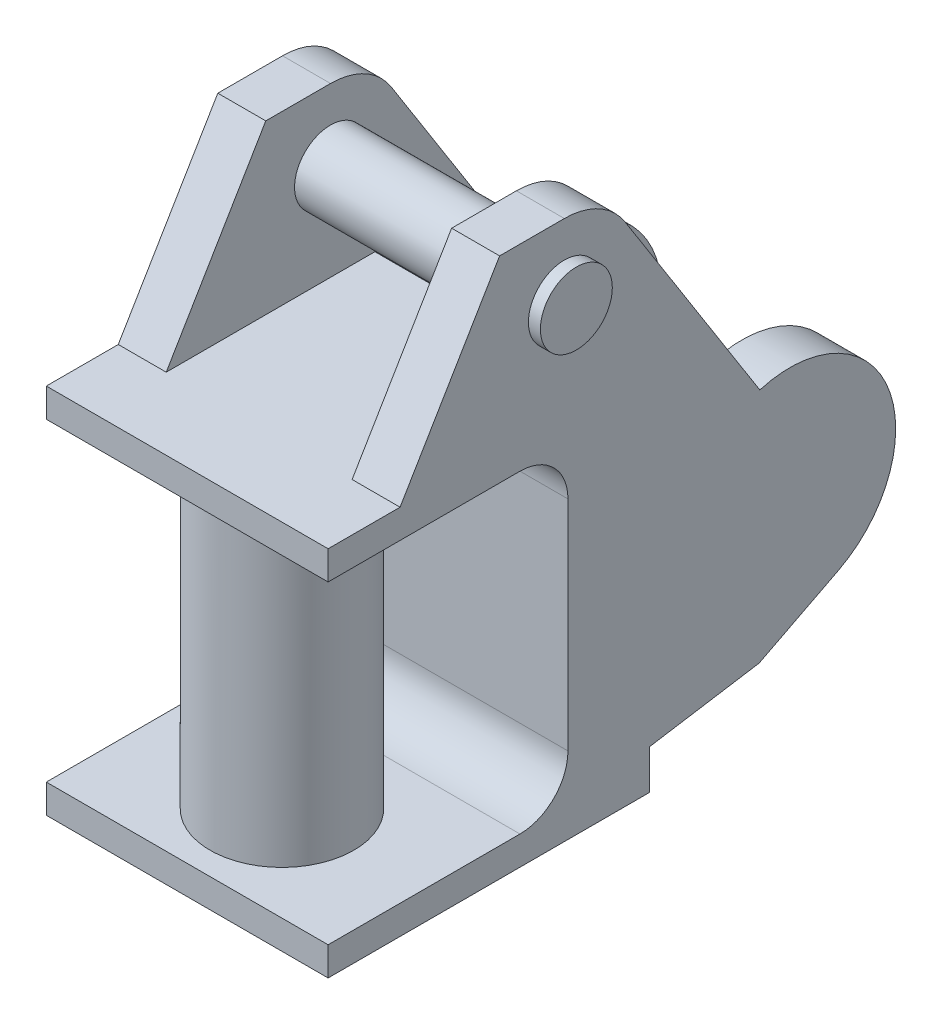
ISO-10303-21;
HEADER;
FILE_DESCRIPTION(('STEP AP214'),'2;1');
FILE_NAME('part.step','',(''),(''),'','','');
FILE_SCHEMA(('AUTOMOTIVE_DESIGN { 1 0 10303 214 1 1 1 1 }'));
ENDSEC;
DATA;
#1=APPLICATION_CONTEXT('core data for automotive mechanical design processes');
#2=APPLICATION_PROTOCOL_DEFINITION('international standard','automotive_design',2000,#1);
#3=PRODUCT_CONTEXT('',#1,'mechanical');
#4=PRODUCT('Part','Part','',(#3));
#5=PRODUCT_RELATED_PRODUCT_CATEGORY('part','',(#4));
#6=PRODUCT_DEFINITION_FORMATION('','',#4);
#7=PRODUCT_DEFINITION_CONTEXT('part definition',#1,'design');
#8=PRODUCT_DEFINITION('design','',#6,#7);
#9=PRODUCT_DEFINITION_SHAPE('','',#8);
#10=(LENGTH_UNIT() NAMED_UNIT(*) SI_UNIT(.MILLI.,.METRE.));
#11=(NAMED_UNIT(*) PLANE_ANGLE_UNIT() SI_UNIT($,.RADIAN.));
#12=(NAMED_UNIT(*) SI_UNIT($,.STERADIAN.) SOLID_ANGLE_UNIT());
#13=UNCERTAINTY_MEASURE_WITH_UNIT(LENGTH_MEASURE(1.E-05),#10,'distance_accuracy_value','');
#14=(GEOMETRIC_REPRESENTATION_CONTEXT(3) GLOBAL_UNCERTAINTY_ASSIGNED_CONTEXT((#13)) GLOBAL_UNIT_ASSIGNED_CONTEXT((#10,
#11,#12)) REPRESENTATION_CONTEXT('',''));
#15=CARTESIAN_POINT('',(0.,0.,0.));
#16=DIRECTION('',(0.,0.,1.));
#17=DIRECTION('',(1.,0.,0.));
#18=AXIS2_PLACEMENT_3D('',#15,#16,#17);
#19=CARTESIAN_POINT('',(0.,160.,-385.));
#20=DIRECTION('',(-1.,0.,0.));
#21=DIRECTION('',(0.,0.,1.));
#22=AXIS2_PLACEMENT_3D('',#19,#20,#21);
#23=CYLINDRICAL_SURFACE('',#22,20.);
#24=CARTESIAN_POINT('',(0.,160.,-385.));
#25=DIRECTION('',(1.,0.,0.));
#26=DIRECTION('',(0.,0.,-1.));
#27=AXIS2_PLACEMENT_3D('',#24,#25,#26);
#28=CIRCLE('',#27,20.);
#29=CARTESIAN_POINT('',(0.,160.,-405.));
#30=VERTEX_POINT('',#29);
#31=EDGE_CURVE('E11',#30,#30,#28,.T.);
#32=ORIENTED_EDGE('',*,*,#31,.F.);
#33=EDGE_LOOP('',(#32));
#34=FACE_BOUND('',#33,.T.);
#35=CARTESIAN_POINT('',(-155.,160.,-385.));
#36=DIRECTION('',(1.,0.,0.));
#37=DIRECTION('',(0.,0.,-1.));
#38=AXIS2_PLACEMENT_3D('',#35,#36,#37);
#39=CIRCLE('',#38,20.);
#40=CARTESIAN_POINT('',(-155.,160.,-405.));
#41=VERTEX_POINT('',#40);
#42=EDGE_CURVE('E45',#41,#41,#39,.T.);
#43=ORIENTED_EDGE('',*,*,#42,.T.);
#44=EDGE_LOOP('',(#43));
#45=FACE_BOUND('',#44,.T.);
#46=ADVANCED_FACE('F42',(#34,#45),#23,.T.);
#47=CARTESIAN_POINT('',(0.,160.,-385.));
#48=DIRECTION('',(1.,0.,0.));
#49=DIRECTION('',(0.,0.,-1.));
#50=AXIS2_PLACEMENT_3D('',#47,#48,#49);
#51=PLANE('',#50);
#52=ORIENTED_EDGE('',*,*,#31,.T.);
#53=EDGE_LOOP('',(#52));
#54=FACE_BOUND('',#53,.T.);
#55=ADVANCED_FACE('F57',(#54),#51,.T.);
#56=CARTESIAN_POINT('',(-155.,160.,-385.));
#57=DIRECTION('',(1.,0.,0.));
#58=DIRECTION('',(0.,0.,-1.));
#59=AXIS2_PLACEMENT_3D('',#56,#57,#58);
#60=PLANE('',#59);
#61=ORIENTED_EDGE('',*,*,#42,.F.);
#62=EDGE_LOOP('',(#61));
#63=FACE_BOUND('',#62,.T.);
#64=ADVANCED_FACE('F55',(#63),#60,.F.);
#65=CLOSED_SHELL('',(#46,#55,#64));
#66=MANIFOLD_SOLID_BREP('B2',#65);
#67=CARTESIAN_POINT('',(40.,160.,-385.));
#68=DIRECTION('',(1.,0.,0.));
#69=DIRECTION('',(0.,0.,-1.));
#70=AXIS2_PLACEMENT_3D('',#67,#68,#69);
#71=PLANE('',#70);
#72=DIRECTION('',(0.,-1.,0.));
#73=VECTOR('',#72,1.);
#74=CARTESIAN_POINT('',(40.,24.,0.));
#75=LINE('',#74,#73);
#76=CARTESIAN_POINT('',(40.,24.,0.));
#77=VERTEX_POINT('',#76);
#78=CARTESIAN_POINT('',(40.,0.,0.));
#79=VERTEX_POINT('',#78);
#80=EDGE_CURVE('E404',#77,#79,#75,.T.);
#81=ORIENTED_EDGE('',*,*,#80,.T.);
#82=DIRECTION('',(0.,0.,-1.));
#83=VECTOR('',#82,1.);
#84=CARTESIAN_POINT('',(40.,0.,0.));
#85=LINE('',#84,#83);
#86=CARTESIAN_POINT('',(40.,0.,-268.));
#87=VERTEX_POINT('',#86);
#88=EDGE_CURVE('E276',#79,#87,#85,.T.);
#89=ORIENTED_EDGE('',*,*,#88,.T.);
#90=DIRECTION('',(0.,1.,0.));
#91=VECTOR('',#90,1.);
#92=CARTESIAN_POINT('',(40.,0.,-268.));
#93=LINE('',#92,#91);
#94=CARTESIAN_POINT('',(40.,33.,-268.));
#95=VERTEX_POINT('',#94);
#96=EDGE_CURVE('E408',#87,#95,#93,.T.);
#97=ORIENTED_EDGE('',*,*,#96,.T.);
#98=DIRECTION('',(0.,0.15855079486993,-0.987350821869367));
#99=VECTOR('',#98,1.);
#100=CARTESIAN_POINT('',(40.,33.,-268.));
#101=LINE('',#100,#99);
#102=CARTESIAN_POINT('',(40.,47.6759727103171,-359.392375100683));
#103=VERTEX_POINT('',#102);
#104=EDGE_CURVE('E410',#95,#103,#101,.T.);
#105=ORIENTED_EDGE('',*,*,#104,.T.);
#106=DIRECTION('',(0.,0.455898949992531,-0.890031542921771));
#107=VECTOR('',#106,1.);
#108=CARTESIAN_POINT('',(40.,47.6759727103171,-359.392375100683));
#109=LINE('',#108,#107);
#110=CARTESIAN_POINT('',(40.,81.4124950097644,-425.254709276894));
#111=VERTEX_POINT('',#110);
#112=EDGE_CURVE('E412',#103,#111,#109,.T.);
#113=ORIENTED_EDGE('',*,*,#112,.T.);
#114=CARTESIAN_POINT('',(40.,160.,-385.));
#115=DIRECTION('',(1.,0.,0.));
#116=DIRECTION('',(0.,0.,-1.));
#117=AXIS2_PLACEMENT_3D('',#114,#115,#116);
#118=CIRCLE('',#117,88.2974380124222);
#119=CARTESIAN_POINT('',(40.,244.687799182257,-360.01171816184));
#120=VERTEX_POINT('',#119);
#121=EDGE_CURVE('E414',#111,#120,#118,.T.);
#122=ORIENTED_EDGE('',*,*,#121,.T.);
#123=DIRECTION('',(0.,0.844906176204705,0.534914529070902));
#124=VECTOR('',#123,1.);
#125=CARTESIAN_POINT('',(40.,244.687799182257,-360.01171816184));
#126=LINE('',#125,#124);
#127=CARTESIAN_POINT('',(40.,422.094871744254,-247.694370572282));
#128=VERTEX_POINT('',#127);
#129=EDGE_CURVE('E416',#120,#128,#126,.T.);
#130=ORIENTED_EDGE('',*,*,#129,.T.);
#131=CARTESIAN_POINT('',(40.,390.,-197.));
#132=DIRECTION('',(1.,0.,0.));
#133=DIRECTION('',(0.,0.,-1.));
#134=AXIS2_PLACEMENT_3D('',#131,#132,#133);
#135=CIRCLE('',#134,60.);
#136=CARTESIAN_POINT('',(40.,450.,-197.));
#137=VERTEX_POINT('',#136);
#138=EDGE_CURVE('E418',#128,#137,#135,.T.);
#139=ORIENTED_EDGE('',*,*,#138,.T.);
#140=DIRECTION('',(0.,0.,1.));
#141=VECTOR('',#140,1.);
#142=CARTESIAN_POINT('',(40.,450.,-197.));
#143=LINE('',#142,#141);
#144=CARTESIAN_POINT('',(40.,450.,-143.));
#145=VERTEX_POINT('',#144);
#146=EDGE_CURVE('E420',#137,#145,#143,.T.);
#147=ORIENTED_EDGE('',*,*,#146,.T.);
#148=DIRECTION('',(0.,-0.860191712453528,0.509970800954592));
#149=VECTOR('',#148,1.);
#150=CARTESIAN_POINT('',(40.,450.,-143.));
#151=LINE('',#150,#149);
#152=CARTESIAN_POINT('',(40.,310.,-60.));
#153=VERTEX_POINT('',#152);
#154=EDGE_CURVE('E422',#145,#153,#151,.T.);
#155=ORIENTED_EDGE('',*,*,#154,.T.);
#156=DIRECTION('',(0.,0.,1.));
#157=VECTOR('',#156,1.);
#158=CARTESIAN_POINT('',(40.,310.,-60.));
#159=LINE('',#158,#157);
#160=CARTESIAN_POINT('',(40.,310.,0.));
#161=VERTEX_POINT('',#160);
#162=EDGE_CURVE('E424',#153,#161,#159,.T.);
#163=ORIENTED_EDGE('',*,*,#162,.T.);
#164=DIRECTION('',(0.,-1.,0.));
#165=VECTOR('',#164,1.);
#166=CARTESIAN_POINT('',(40.,310.,0.));
#167=LINE('',#166,#165);
#168=CARTESIAN_POINT('',(40.,286.,0.));
#169=VERTEX_POINT('',#168);
#170=EDGE_CURVE('E426',#161,#169,#167,.T.);
#171=ORIENTED_EDGE('',*,*,#170,.T.);
#172=DIRECTION('',(0.,0.,-1.));
#173=VECTOR('',#172,1.);
#174=CARTESIAN_POINT('',(40.,286.,0.));
#175=LINE('',#174,#173);
#176=CARTESIAN_POINT('',(40.,286.,-160.));
#177=VERTEX_POINT('',#176);
#178=EDGE_CURVE('E428',#169,#177,#175,.T.);
#179=ORIENTED_EDGE('',*,*,#178,.T.);
#180=CARTESIAN_POINT('',(40.,246.,-160.));
#181=DIRECTION('',(1.,0.,0.));
#182=DIRECTION('',(0.,0.,-1.));
#183=AXIS2_PLACEMENT_3D('',#180,#181,#182);
#184=CIRCLE('',#183,40.);
#185=CARTESIAN_POINT('',(40.,246.,-200.));
#186=VERTEX_POINT('',#185);
#187=EDGE_CURVE('E493',#177,#186,#184,.F.);
#188=ORIENTED_EDGE('',*,*,#187,.T.);
#189=DIRECTION('',(0.,-1.,0.));
#190=VECTOR('',#189,1.);
#191=CARTESIAN_POINT('',(40.,286.,-200.));
#192=LINE('',#191,#190);
#193=CARTESIAN_POINT('',(40.,64.,-200.));
#194=VERTEX_POINT('',#193);
#195=EDGE_CURVE('E431',#186,#194,#192,.T.);
#196=ORIENTED_EDGE('',*,*,#195,.T.);
#197=CARTESIAN_POINT('',(40.,64.,-160.));
#198=DIRECTION('',(1.,0.,0.));
#199=DIRECTION('',(0.,0.,-1.));
#200=AXIS2_PLACEMENT_3D('',#197,#198,#199);
#201=CIRCLE('',#200,40.);
#202=CARTESIAN_POINT('',(40.,24.,-160.));
#203=VERTEX_POINT('',#202);
#204=EDGE_CURVE('E97',#194,#203,#201,.F.);
#205=ORIENTED_EDGE('',*,*,#204,.T.);
#206=DIRECTION('',(0.,0.,1.));
#207=VECTOR('',#206,1.);
#208=CARTESIAN_POINT('',(40.,24.,-200.));
#209=LINE('',#208,#207);
#210=EDGE_CURVE('E433',#203,#77,#209,.T.);
#211=ORIENTED_EDGE('',*,*,#210,.T.);
#212=EDGE_LOOP('',(#81,#89,#97,#105,#113,#122,#130,#139,#147,#155,#163,#171,#179,#188,#196,#205,#211));
#213=FACE_BOUND('',#212,.T.);
#214=CARTESIAN_POINT('',(40.,390.,-197.));
#215=DIRECTION('',(1.,0.,0.));
#216=DIRECTION('',(0.,0.,-1.));
#217=AXIS2_PLACEMENT_3D('',#214,#215,#216);
#218=CIRCLE('',#217,30.);
#219=CARTESIAN_POINT('',(40.,390.,-227.));
#220=VERTEX_POINT('',#219);
#221=EDGE_CURVE('E400',#220,#220,#218,.T.);
#222=ORIENTED_EDGE('',*,*,#221,.F.);
#223=EDGE_LOOP('',(#222));
#224=FACE_BOUND('',#223,.T.);
#225=ADVANCED_FACE('F82',(#213,#224),#71,.T.);
#226=CARTESIAN_POINT('',(0.,160.,-385.));
#227=DIRECTION('',(1.,0.,0.));
#228=DIRECTION('',(0.,0.,-1.));
#229=AXIS2_PLACEMENT_3D('',#226,#227,#228);
#230=PLANE('',#229);
#231=DIRECTION('',(0.,0.,-1.));
#232=VECTOR('',#231,1.);
#233=CARTESIAN_POINT('',(0.,0.,0.));
#234=LINE('',#233,#232);
#235=CARTESIAN_POINT('',(0.,0.,-234.));
#236=VERTEX_POINT('',#235);
#237=CARTESIAN_POINT('',(0.,0.,-268.));
#238=VERTEX_POINT('',#237);
#239=EDGE_CURVE('E403',#236,#238,#234,.T.);
#240=ORIENTED_EDGE('',*,*,#239,.F.);
#241=DIRECTION('',(0.,1.,0.));
#242=VECTOR('',#241,1.);
#243=CARTESIAN_POINT('',(0.,0.,-234.));
#244=LINE('',#243,#242);
#245=CARTESIAN_POINT('',(0.,310.,-234.));
#246=VERTEX_POINT('',#245);
#247=EDGE_CURVE('E384',#236,#246,#244,.T.);
#248=ORIENTED_EDGE('',*,*,#247,.T.);
#249=DIRECTION('',(0.,0.,1.));
#250=VECTOR('',#249,1.);
#251=CARTESIAN_POINT('',(0.,310.,-234.));
#252=LINE('',#251,#250);
#253=CARTESIAN_POINT('',(0.,310.,-60.));
#254=VERTEX_POINT('',#253);
#255=EDGE_CURVE('E387',#246,#254,#252,.T.);
#256=ORIENTED_EDGE('',*,*,#255,.T.);
#257=DIRECTION('',(0.,-0.860191712453528,0.509970800954592));
#258=VECTOR('',#257,1.);
#259=CARTESIAN_POINT('',(0.,450.,-143.));
#260=LINE('',#259,#258);
#261=CARTESIAN_POINT('',(0.,450.,-143.));
#262=VERTEX_POINT('',#261);
#263=EDGE_CURVE('E406',#262,#254,#260,.T.);
#264=ORIENTED_EDGE('',*,*,#263,.F.);
#265=DIRECTION('',(0.,0.,1.));
#266=VECTOR('',#265,1.);
#267=CARTESIAN_POINT('',(0.,450.,-197.));
#268=LINE('',#267,#266);
#269=CARTESIAN_POINT('',(0.,450.,-197.));
#270=VERTEX_POINT('',#269);
#271=EDGE_CURVE('E448',#270,#262,#268,.T.);
#272=ORIENTED_EDGE('',*,*,#271,.F.);
#273=CARTESIAN_POINT('',(0.,390.,-197.));
#274=DIRECTION('',(1.,0.,0.));
#275=DIRECTION('',(0.,0.,-1.));
#276=AXIS2_PLACEMENT_3D('',#273,#274,#275);
#277=CIRCLE('',#276,60.);
#278=CARTESIAN_POINT('',(0.,422.094871744254,-247.694370572282));
#279=VERTEX_POINT('',#278);
#280=EDGE_CURVE('E446',#279,#270,#277,.T.);
#281=ORIENTED_EDGE('',*,*,#280,.F.);
#282=DIRECTION('',(0.,0.844906176204705,0.534914529070902));
#283=VECTOR('',#282,1.);
#284=CARTESIAN_POINT('',(0.,244.687799182257,-360.01171816184));
#285=LINE('',#284,#283);
#286=CARTESIAN_POINT('',(0.,244.687799182257,-360.01171816184));
#287=VERTEX_POINT('',#286);
#288=EDGE_CURVE('E444',#287,#279,#285,.T.);
#289=ORIENTED_EDGE('',*,*,#288,.F.);
#290=CARTESIAN_POINT('',(0.,160.,-385.));
#291=DIRECTION('',(1.,0.,0.));
#292=DIRECTION('',(0.,0.,-1.));
#293=AXIS2_PLACEMENT_3D('',#290,#291,#292);
#294=CIRCLE('',#293,88.2974380124222);
#295=CARTESIAN_POINT('',(0.,81.4124950097644,-425.254709276894));
#296=VERTEX_POINT('',#295);
#297=EDGE_CURVE('E442',#296,#287,#294,.T.);
#298=ORIENTED_EDGE('',*,*,#297,.F.);
#299=DIRECTION('',(0.,0.455898949992531,-0.890031542921771));
#300=VECTOR('',#299,1.);
#301=CARTESIAN_POINT('',(0.,47.6759727103171,-359.392375100683));
#302=LINE('',#301,#300);
#303=CARTESIAN_POINT('',(0.,47.6759727103171,-359.392375100683));
#304=VERTEX_POINT('',#303);
#305=EDGE_CURVE('E440',#304,#296,#302,.T.);
#306=ORIENTED_EDGE('',*,*,#305,.F.);
#307=DIRECTION('',(0.,0.15855079486993,-0.987350821869367));
#308=VECTOR('',#307,1.);
#309=CARTESIAN_POINT('',(0.,33.,-268.));
#310=LINE('',#309,#308);
#311=CARTESIAN_POINT('',(0.,33.,-268.));
#312=VERTEX_POINT('',#311);
#313=EDGE_CURVE('E438',#312,#304,#310,.T.);
#314=ORIENTED_EDGE('',*,*,#313,.F.);
#315=DIRECTION('',(0.,1.,0.));
#316=VECTOR('',#315,1.);
#317=CARTESIAN_POINT('',(0.,0.,-268.));
#318=LINE('',#317,#316);
#319=EDGE_CURVE('E436',#238,#312,#318,.T.);
#320=ORIENTED_EDGE('',*,*,#319,.F.);
#321=EDGE_LOOP('',(#240,#248,#256,#264,#272,#281,#289,#298,#306,#314,#320));
#322=FACE_BOUND('',#321,.T.);
#323=CARTESIAN_POINT('',(0.,390.,-197.));
#324=DIRECTION('',(1.,0.,0.));
#325=DIRECTION('',(0.,0.,-1.));
#326=AXIS2_PLACEMENT_3D('',#323,#324,#325);
#327=CIRCLE('',#326,30.);
#328=CARTESIAN_POINT('',(0.,390.,-227.));
#329=VERTEX_POINT('',#328);
#330=EDGE_CURVE('E955',#329,#329,#327,.F.);
#331=ORIENTED_EDGE('',*,*,#330,.F.);
#332=EDGE_LOOP('',(#331));
#333=FACE_BOUND('',#332,.T.);
#334=ADVANCED_FACE('F568',(#322,#333),#230,.F.);
#335=CARTESIAN_POINT('',(40.,24.,0.));
#336=DIRECTION('',(0.,0.,-1.));
#337=DIRECTION('',(0.,1.,0.));
#338=AXIS2_PLACEMENT_3D('',#335,#336,#337);
#339=PLANE('',#338);
#340=DIRECTION('',(-1.,0.,0.));
#341=VECTOR('',#340,1.);
#342=CARTESIAN_POINT('',(40.,24.,0.));
#343=LINE('',#342,#341);
#344=CARTESIAN_POINT('',(-195.,24.,0.));
#345=VERTEX_POINT('',#344);
#346=EDGE_CURVE('E297',#77,#345,#343,.T.);
#347=ORIENTED_EDGE('',*,*,#346,.T.);
#348=DIRECTION('',(0.,-1.,0.));
#349=VECTOR('',#348,1.);
#350=CARTESIAN_POINT('',(-195.,24.,0.));
#351=LINE('',#350,#349);
#352=CARTESIAN_POINT('',(-195.,0.,0.));
#353=VERTEX_POINT('',#352);
#354=EDGE_CURVE('E289',#345,#353,#351,.T.);
#355=ORIENTED_EDGE('',*,*,#354,.T.);
#356=DIRECTION('',(-1.,0.,0.));
#357=VECTOR('',#356,1.);
#358=CARTESIAN_POINT('',(40.,0.,0.));
#359=LINE('',#358,#357);
#360=EDGE_CURVE('E269',#79,#353,#359,.T.);
#361=ORIENTED_EDGE('',*,*,#360,.F.);
#362=ORIENTED_EDGE('',*,*,#80,.F.);
#363=EDGE_LOOP('',(#347,#355,#361,#362));
#364=FACE_BOUND('',#363,.T.);
#365=ADVANCED_FACE('F295',(#364),#339,.F.);
#366=CARTESIAN_POINT('',(40.,0.,0.));
#367=DIRECTION('',(0.,1.,0.));
#368=DIRECTION('',(0.,0.,1.));
#369=AXIS2_PLACEMENT_3D('',#366,#367,#368);
#370=PLANE('',#369);
#371=ORIENTED_EDGE('',*,*,#360,.T.);
#372=DIRECTION('',(0.,0.,-1.));
#373=VECTOR('',#372,1.);
#374=CARTESIAN_POINT('',(-195.,0.,0.));
#375=LINE('',#374,#373);
#376=CARTESIAN_POINT('',(-195.,0.,-268.));
#377=VERTEX_POINT('',#376);
#378=EDGE_CURVE('E273',#353,#377,#375,.T.);
#379=ORIENTED_EDGE('',*,*,#378,.T.);
#380=DIRECTION('',(1.,0.,0.));
#381=VECTOR('',#380,1.);
#382=CARTESIAN_POINT('',(-195.,0.,-268.));
#383=LINE('',#382,#381);
#384=CARTESIAN_POINT('',(-155.,0.,-268.));
#385=VERTEX_POINT('',#384);
#386=EDGE_CURVE('E381',#377,#385,#383,.T.);
#387=ORIENTED_EDGE('',*,*,#386,.T.);
#388=DIRECTION('',(0.,0.,-1.));
#389=VECTOR('',#388,1.);
#390=CARTESIAN_POINT('',(-155.,0.,0.));
#391=LINE('',#390,#389);
#392=CARTESIAN_POINT('',(-155.,0.,-234.));
#393=VERTEX_POINT('',#392);
#394=EDGE_CURVE('E344',#393,#385,#391,.T.);
#395=ORIENTED_EDGE('',*,*,#394,.F.);
#396=DIRECTION('',(-1.,0.,0.));
#397=VECTOR('',#396,1.);
#398=CARTESIAN_POINT('',(0.,0.,-234.));
#399=LINE('',#398,#397);
#400=EDGE_CURVE('E397',#236,#393,#399,.T.);
#401=ORIENTED_EDGE('',*,*,#400,.F.);
#402=ORIENTED_EDGE('',*,*,#239,.T.);
#403=DIRECTION('',(-1.,0.,0.));
#404=VECTOR('',#403,1.);
#405=CARTESIAN_POINT('',(40.,0.,-268.));
#406=LINE('',#405,#404);
#407=EDGE_CURVE('E282',#87,#238,#406,.T.);
#408=ORIENTED_EDGE('',*,*,#407,.F.);
#409=ORIENTED_EDGE('',*,*,#88,.F.);
#410=EDGE_LOOP('',(#371,#379,#387,#395,#401,#402,#408,#409));
#411=FACE_BOUND('',#410,.T.);
#412=ADVANCED_FACE('F271',(#411),#370,.F.);
#413=CARTESIAN_POINT('',(40.,0.,-268.));
#414=DIRECTION('',(0.,0.,1.));
#415=DIRECTION('',(1.,0.,0.));
#416=AXIS2_PLACEMENT_3D('',#413,#414,#415);
#417=PLANE('',#416);
#418=ORIENTED_EDGE('',*,*,#319,.T.);
#419=DIRECTION('',(-1.,0.,0.));
#420=VECTOR('',#419,1.);
#421=CARTESIAN_POINT('',(40.,33.,-268.));
#422=LINE('',#421,#420);
#423=EDGE_CURVE('E478',#95,#312,#422,.T.);
#424=ORIENTED_EDGE('',*,*,#423,.F.);
#425=ORIENTED_EDGE('',*,*,#96,.F.);
#426=ORIENTED_EDGE('',*,*,#407,.T.);
#427=EDGE_LOOP('',(#418,#424,#425,#426));
#428=FACE_BOUND('',#427,.T.);
#429=ADVANCED_FACE('F573',(#428),#417,.F.);
#430=CARTESIAN_POINT('',(40.,33.,-268.));
#431=DIRECTION('',(0.,0.987350821869367,0.15855079486993));
#432=DIRECTION('',(0.,-0.15855079486993,0.987350821869367));
#433=AXIS2_PLACEMENT_3D('',#430,#431,#432);
#434=PLANE('',#433);
#435=ORIENTED_EDGE('',*,*,#313,.T.);
#436=DIRECTION('',(-1.,0.,0.));
#437=VECTOR('',#436,1.);
#438=CARTESIAN_POINT('',(40.,47.6759727103171,-359.392375100683));
#439=LINE('',#438,#437);
#440=EDGE_CURVE('E475',#103,#304,#439,.T.);
#441=ORIENTED_EDGE('',*,*,#440,.F.);
#442=ORIENTED_EDGE('',*,*,#104,.F.);
#443=ORIENTED_EDGE('',*,*,#423,.T.);
#444=EDGE_LOOP('',(#435,#441,#442,#443));
#445=FACE_BOUND('',#444,.T.);
#446=ADVANCED_FACE('F580',(#445),#434,.F.);
#447=CARTESIAN_POINT('',(40.,47.6759727103171,-359.392375100683));
#448=DIRECTION('',(0.,0.890031542921771,0.455898949992531));
#449=DIRECTION('',(0.,-0.455898949992531,0.890031542921771));
#450=AXIS2_PLACEMENT_3D('',#447,#448,#449);
#451=PLANE('',#450);
#452=ORIENTED_EDGE('',*,*,#305,.T.);
#453=DIRECTION('',(-1.,0.,0.));
#454=VECTOR('',#453,1.);
#455=CARTESIAN_POINT('',(40.,81.4124950097644,-425.254709276894));
#456=LINE('',#455,#454);
#457=EDGE_CURVE('E472',#111,#296,#456,.T.);
#458=ORIENTED_EDGE('',*,*,#457,.F.);
#459=ORIENTED_EDGE('',*,*,#112,.F.);
#460=ORIENTED_EDGE('',*,*,#440,.T.);
#461=EDGE_LOOP('',(#452,#458,#459,#460));
#462=FACE_BOUND('',#461,.T.);
#463=ADVANCED_FACE('F583',(#462),#451,.F.);
#464=CARTESIAN_POINT('',(40.,160.,-385.));
#465=DIRECTION('',(-1.,0.,0.));
#466=DIRECTION('',(0.,0.,1.));
#467=AXIS2_PLACEMENT_3D('',#464,#465,#466);
#468=CYLINDRICAL_SURFACE('',#467,88.2974380124222);
#469=ORIENTED_EDGE('',*,*,#297,.T.);
#470=DIRECTION('',(-1.,0.,0.));
#471=VECTOR('',#470,1.);
#472=CARTESIAN_POINT('',(40.,244.687799182257,-360.01171816184));
#473=LINE('',#472,#471);
#474=EDGE_CURVE('E469',#120,#287,#473,.T.);
#475=ORIENTED_EDGE('',*,*,#474,.F.);
#476=ORIENTED_EDGE('',*,*,#121,.F.);
#477=ORIENTED_EDGE('',*,*,#457,.T.);
#478=EDGE_LOOP('',(#469,#475,#476,#477));
#479=FACE_BOUND('',#478,.T.);
#480=ADVANCED_FACE('F588',(#479),#468,.T.);
#481=CARTESIAN_POINT('',(40.,244.687799182257,-360.01171816184));
#482=DIRECTION('',(0.,-0.534914529070902,0.844906176204705));
#483=DIRECTION('',(0.,-0.844906176204705,-0.534914529070902));
#484=AXIS2_PLACEMENT_3D('',#481,#482,#483);
#485=PLANE('',#484);
#486=ORIENTED_EDGE('',*,*,#288,.T.);
#487=DIRECTION('',(-1.,0.,0.));
#488=VECTOR('',#487,1.);
#489=CARTESIAN_POINT('',(40.,422.094871744254,-247.694370572282));
#490=LINE('',#489,#488);
#491=EDGE_CURVE('E466',#128,#279,#490,.T.);
#492=ORIENTED_EDGE('',*,*,#491,.F.);
#493=ORIENTED_EDGE('',*,*,#129,.F.);
#494=ORIENTED_EDGE('',*,*,#474,.T.);
#495=EDGE_LOOP('',(#486,#492,#493,#494));
#496=FACE_BOUND('',#495,.T.);
#497=ADVANCED_FACE('F594',(#496),#485,.F.);
#498=CARTESIAN_POINT('',(40.,390.,-197.));
#499=DIRECTION('',(-1.,0.,0.));
#500=DIRECTION('',(0.,0.,1.));
#501=AXIS2_PLACEMENT_3D('',#498,#499,#500);
#502=CYLINDRICAL_SURFACE('',#501,60.);
#503=ORIENTED_EDGE('',*,*,#280,.T.);
#504=DIRECTION('',(-1.,0.,0.));
#505=VECTOR('',#504,1.);
#506=CARTESIAN_POINT('',(40.,450.,-197.));
#507=LINE('',#506,#505);
#508=EDGE_CURVE('E463',#137,#270,#507,.T.);
#509=ORIENTED_EDGE('',*,*,#508,.F.);
#510=ORIENTED_EDGE('',*,*,#138,.F.);
#511=ORIENTED_EDGE('',*,*,#491,.T.);
#512=EDGE_LOOP('',(#503,#509,#510,#511));
#513=FACE_BOUND('',#512,.T.);
#514=ADVANCED_FACE('F598',(#513),#502,.T.);
#515=CARTESIAN_POINT('',(40.,450.,-197.));
#516=DIRECTION('',(0.,-1.,0.));
#517=DIRECTION('',(0.,0.,-1.));
#518=AXIS2_PLACEMENT_3D('',#515,#516,#517);
#519=PLANE('',#518);
#520=ORIENTED_EDGE('',*,*,#271,.T.);
#521=DIRECTION('',(-1.,0.,0.));
#522=VECTOR('',#521,1.);
#523=CARTESIAN_POINT('',(40.,450.,-143.));
#524=LINE('',#523,#522);
#525=EDGE_CURVE('E460',#145,#262,#524,.T.);
#526=ORIENTED_EDGE('',*,*,#525,.F.);
#527=ORIENTED_EDGE('',*,*,#146,.F.);
#528=ORIENTED_EDGE('',*,*,#508,.T.);
#529=EDGE_LOOP('',(#520,#526,#527,#528));
#530=FACE_BOUND('',#529,.T.);
#531=ADVANCED_FACE('F603',(#530),#519,.F.);
#532=CARTESIAN_POINT('',(40.,450.,-143.));
#533=DIRECTION('',(0.,-0.509970800954592,-0.860191712453528));
#534=DIRECTION('',(0.,0.860191712453528,-0.509970800954592));
#535=AXIS2_PLACEMENT_3D('',#532,#533,#534);
#536=PLANE('',#535);
#537=ORIENTED_EDGE('',*,*,#263,.T.);
#538=DIRECTION('',(-1.,0.,0.));
#539=VECTOR('',#538,1.);
#540=CARTESIAN_POINT('',(40.,310.,-60.));
#541=LINE('',#540,#539);
#542=EDGE_CURVE('E457',#153,#254,#541,.T.);
#543=ORIENTED_EDGE('',*,*,#542,.F.);
#544=ORIENTED_EDGE('',*,*,#154,.F.);
#545=ORIENTED_EDGE('',*,*,#525,.T.);
#546=EDGE_LOOP('',(#537,#543,#544,#545));
#547=FACE_BOUND('',#546,.T.);
#548=ADVANCED_FACE('F607',(#547),#536,.F.);
#549=CARTESIAN_POINT('',(40.,310.,-60.));
#550=DIRECTION('',(0.,-1.,0.));
#551=DIRECTION('',(0.,0.,-1.));
#552=AXIS2_PLACEMENT_3D('',#549,#550,#551);
#553=PLANE('',#552);
#554=ORIENTED_EDGE('',*,*,#542,.T.);
#555=ORIENTED_EDGE('',*,*,#255,.F.);
#556=DIRECTION('',(-1.,0.,0.));
#557=VECTOR('',#556,1.);
#558=CARTESIAN_POINT('',(0.,310.,-234.));
#559=LINE('',#558,#557);
#560=CARTESIAN_POINT('',(-155.,310.,-234.));
#561=VERTEX_POINT('',#560);
#562=EDGE_CURVE('E390',#246,#561,#559,.T.);
#563=ORIENTED_EDGE('',*,*,#562,.T.);
#564=DIRECTION('',(0.,0.,1.));
#565=VECTOR('',#564,1.);
#566=CARTESIAN_POINT('',(-155.,310.,-234.));
#567=LINE('',#566,#565);
#568=CARTESIAN_POINT('',(-155.,310.,-60.));
#569=VERTEX_POINT('',#568);
#570=EDGE_CURVE('E388',#561,#569,#567,.T.);
#571=ORIENTED_EDGE('',*,*,#570,.T.);
#572=DIRECTION('',(1.,0.,0.));
#573=VECTOR('',#572,1.);
#574=CARTESIAN_POINT('',(-195.,310.,-60.));
#575=LINE('',#574,#573);
#576=CARTESIAN_POINT('',(-195.,310.,-60.));
#577=VERTEX_POINT('',#576);
#578=EDGE_CURVE('E343',#577,#569,#575,.T.);
#579=ORIENTED_EDGE('',*,*,#578,.F.);
#580=DIRECTION('',(0.,0.,1.));
#581=VECTOR('',#580,1.);
#582=CARTESIAN_POINT('',(-195.,310.,-60.));
#583=LINE('',#582,#581);
#584=CARTESIAN_POINT('',(-195.,310.,0.));
#585=VERTEX_POINT('',#584);
#586=EDGE_CURVE('E329',#577,#585,#583,.T.);
#587=ORIENTED_EDGE('',*,*,#586,.T.);
#588=DIRECTION('',(-1.,0.,0.));
#589=VECTOR('',#588,1.);
#590=CARTESIAN_POINT('',(40.,310.,0.));
#591=LINE('',#590,#589);
#592=EDGE_CURVE('E455',#161,#585,#591,.T.);
#593=ORIENTED_EDGE('',*,*,#592,.F.);
#594=ORIENTED_EDGE('',*,*,#162,.F.);
#595=EDGE_LOOP('',(#554,#555,#563,#571,#579,#587,#593,#594));
#596=FACE_BOUND('',#595,.T.);
#597=ADVANCED_FACE('F530',(#596),#553,.F.);
#598=CARTESIAN_POINT('',(40.,310.,0.));
#599=DIRECTION('',(0.,0.,-1.));
#600=DIRECTION('',(0.,1.,0.));
#601=AXIS2_PLACEMENT_3D('',#598,#599,#600);
#602=PLANE('',#601);
#603=ORIENTED_EDGE('',*,*,#592,.T.);
#604=DIRECTION('',(0.,-1.,0.));
#605=VECTOR('',#604,1.);
#606=CARTESIAN_POINT('',(-195.,310.,0.));
#607=LINE('',#606,#605);
#608=CARTESIAN_POINT('',(-195.,286.,0.));
#609=VERTEX_POINT('',#608);
#610=EDGE_CURVE('E332',#585,#609,#607,.T.);
#611=ORIENTED_EDGE('',*,*,#610,.T.);
#612=DIRECTION('',(-1.,0.,0.));
#613=VECTOR('',#612,1.);
#614=CARTESIAN_POINT('',(40.,286.,0.));
#615=LINE('',#614,#613);
#616=EDGE_CURVE('E453',#169,#609,#615,.T.);
#617=ORIENTED_EDGE('',*,*,#616,.F.);
#618=ORIENTED_EDGE('',*,*,#170,.F.);
#619=EDGE_LOOP('',(#603,#611,#617,#618));
#620=FACE_BOUND('',#619,.T.);
#621=ADVANCED_FACE('F524',(#620),#602,.F.);
#622=CARTESIAN_POINT('',(40.,286.,0.));
#623=DIRECTION('',(0.,1.,0.));
#624=DIRECTION('',(0.,0.,1.));
#625=AXIS2_PLACEMENT_3D('',#622,#623,#624);
#626=PLANE('',#625);
#627=CARTESIAN_POINT('',(-77.5,286.,-79.));
#628=DIRECTION('',(0.,1.,0.));
#629=DIRECTION('',(0.,0.,1.));
#630=AXIS2_PLACEMENT_3D('',#627,#628,#629);
#631=CIRCLE('',#630,60.);
#632=CARTESIAN_POINT('',(-77.5,286.,-19.));
#633=VERTEX_POINT('',#632);
#634=EDGE_CURVE('E40',#633,#633,#631,.F.);
#635=ORIENTED_EDGE('',*,*,#634,.F.);
#636=EDGE_LOOP('',(#635));
#637=FACE_BOUND('',#636,.T.);
#638=DIRECTION('',(0.,0.,-1.));
#639=VECTOR('',#638,1.);
#640=CARTESIAN_POINT('',(-195.,286.,0.));
#641=LINE('',#640,#639);
#642=CARTESIAN_POINT('',(-195.,286.,-160.));
#643=VERTEX_POINT('',#642);
#644=EDGE_CURVE('E335',#609,#643,#641,.T.);
#645=ORIENTED_EDGE('',*,*,#644,.T.);
#646=DIRECTION('',(-1.,0.,0.));
#647=VECTOR('',#646,1.);
#648=CARTESIAN_POINT('',(40.,286.,-160.));
#649=LINE('',#648,#647);
#650=EDGE_CURVE('E487',#643,#177,#649,.F.);
#651=ORIENTED_EDGE('',*,*,#650,.T.);
#652=ORIENTED_EDGE('',*,*,#178,.F.);
#653=ORIENTED_EDGE('',*,*,#616,.T.);
#654=EDGE_LOOP('',(#645,#651,#652,#653));
#655=FACE_BOUND('',#654,.T.);
#656=ADVANCED_FACE('F520',(#637,#655),#626,.F.);
#657=CARTESIAN_POINT('',(40.,286.,-200.));
#658=DIRECTION('',(0.,0.,-1.));
#659=DIRECTION('',(0.,1.,0.));
#660=AXIS2_PLACEMENT_3D('',#657,#658,#659);
#661=PLANE('',#660);
#662=ORIENTED_EDGE('',*,*,#195,.F.);
#663=DIRECTION('',(-1.,0.,0.));
#664=VECTOR('',#663,1.);
#665=CARTESIAN_POINT('',(-195.,246.,-200.));
#666=LINE('',#665,#664);
#667=CARTESIAN_POINT('',(-195.,246.,-200.));
#668=VERTEX_POINT('',#667);
#669=EDGE_CURVE('E484',#186,#668,#666,.T.);
#670=ORIENTED_EDGE('',*,*,#669,.T.);
#671=DIRECTION('',(0.,-1.,0.));
#672=VECTOR('',#671,1.);
#673=CARTESIAN_POINT('',(-195.,286.,-200.));
#674=LINE('',#673,#672);
#675=CARTESIAN_POINT('',(-195.,64.,-200.));
#676=VERTEX_POINT('',#675);
#677=EDGE_CURVE('E338',#668,#676,#674,.T.);
#678=ORIENTED_EDGE('',*,*,#677,.T.);
#679=DIRECTION('',(-1.,0.,0.));
#680=VECTOR('',#679,1.);
#681=CARTESIAN_POINT('',(40.,64.,-200.));
#682=LINE('',#681,#680);
#683=EDGE_CURVE('E281',#676,#194,#682,.F.);
#684=ORIENTED_EDGE('',*,*,#683,.T.);
#685=EDGE_LOOP('',(#662,#670,#678,#684));
#686=FACE_BOUND('',#685,.T.);
#687=ADVANCED_FACE('F505',(#686),#661,.F.);
#688=CARTESIAN_POINT('',(40.,24.,-200.));
#689=DIRECTION('',(0.,-1.,0.));
#690=DIRECTION('',(0.,0.,-1.));
#691=AXIS2_PLACEMENT_3D('',#688,#689,#690);
#692=PLANE('',#691);
#693=CARTESIAN_POINT('',(-77.5,24.,-79.));
#694=DIRECTION('',(0.,-1.,0.));
#695=DIRECTION('',(0.,0.,-1.));
#696=AXIS2_PLACEMENT_3D('',#693,#694,#695);
#697=CIRCLE('',#696,60.);
#698=CARTESIAN_POINT('',(-77.5,24.,-139.));
#699=VERTEX_POINT('',#698);
#700=EDGE_CURVE('E90',#699,#699,#697,.F.);
#701=ORIENTED_EDGE('',*,*,#700,.F.);
#702=EDGE_LOOP('',(#701));
#703=FACE_BOUND('',#702,.T.);
#704=ORIENTED_EDGE('',*,*,#210,.F.);
#705=DIRECTION('',(-1.,0.,0.));
#706=VECTOR('',#705,1.);
#707=CARTESIAN_POINT('',(-195.,24.,-160.));
#708=LINE('',#707,#706);
#709=CARTESIAN_POINT('',(-195.,24.,-160.));
#710=VERTEX_POINT('',#709);
#711=EDGE_CURVE('E489',#203,#710,#708,.T.);
#712=ORIENTED_EDGE('',*,*,#711,.T.);
#713=DIRECTION('',(0.,0.,1.));
#714=VECTOR('',#713,1.);
#715=CARTESIAN_POINT('',(-195.,24.,-200.));
#716=LINE('',#715,#714);
#717=EDGE_CURVE('E341',#710,#345,#716,.T.);
#718=ORIENTED_EDGE('',*,*,#717,.T.);
#719=ORIENTED_EDGE('',*,*,#346,.F.);
#720=EDGE_LOOP('',(#704,#712,#718,#719));
#721=FACE_BOUND('',#720,.T.);
#722=ADVANCED_FACE('F501',(#703,#721),#692,.F.);
#723=CARTESIAN_POINT('',(0.,0.,-234.));
#724=DIRECTION('',(0.,0.,1.));
#725=DIRECTION('',(1.,0.,0.));
#726=AXIS2_PLACEMENT_3D('',#723,#724,#725);
#727=PLANE('',#726);
#728=DIRECTION('',(0.,1.,0.));
#729=VECTOR('',#728,1.);
#730=CARTESIAN_POINT('',(-155.,0.,-234.));
#731=LINE('',#730,#729);
#732=EDGE_CURVE('E383',#393,#561,#731,.T.);
#733=ORIENTED_EDGE('',*,*,#732,.T.);
#734=ORIENTED_EDGE('',*,*,#562,.F.);
#735=ORIENTED_EDGE('',*,*,#247,.F.);
#736=ORIENTED_EDGE('',*,*,#400,.T.);
#737=EDGE_LOOP('',(#733,#734,#735,#736));
#738=FACE_BOUND('',#737,.T.);
#739=ADVANCED_FACE('F504',(#738),#727,.F.);
#740=CARTESIAN_POINT('',(-195.,160.,-385.));
#741=DIRECTION('',(-1.,0.,0.));
#742=DIRECTION('',(0.,0.,-1.));
#743=AXIS2_PLACEMENT_3D('',#740,#741,#742);
#744=PLANE('',#743);
#745=ORIENTED_EDGE('',*,*,#354,.F.);
#746=ORIENTED_EDGE('',*,*,#717,.F.);
#747=CARTESIAN_POINT('',(-195.,64.,-160.));
#748=DIRECTION('',(-1.,0.,0.));
#749=DIRECTION('',(0.,0.,1.));
#750=AXIS2_PLACEMENT_3D('',#747,#748,#749);
#751=CIRCLE('',#750,40.);
#752=EDGE_CURVE('E105',#710,#676,#751,.F.);
#753=ORIENTED_EDGE('',*,*,#752,.T.);
#754=ORIENTED_EDGE('',*,*,#677,.F.);
#755=CARTESIAN_POINT('',(-195.,246.,-160.));
#756=DIRECTION('',(-1.,0.,0.));
#757=DIRECTION('',(0.,0.,1.));
#758=AXIS2_PLACEMENT_3D('',#755,#756,#757);
#759=CIRCLE('',#758,40.);
#760=EDGE_CURVE('E491',#668,#643,#759,.F.);
#761=ORIENTED_EDGE('',*,*,#760,.T.);
#762=ORIENTED_EDGE('',*,*,#644,.F.);
#763=ORIENTED_EDGE('',*,*,#610,.F.);
#764=ORIENTED_EDGE('',*,*,#586,.F.);
#765=DIRECTION('',(0.,-0.860191712453528,0.509970800954592));
#766=VECTOR('',#765,1.);
#767=CARTESIAN_POINT('',(-195.,450.,-143.));
#768=LINE('',#767,#766);
#769=CARTESIAN_POINT('',(-195.,450.,-143.));
#770=VERTEX_POINT('',#769);
#771=EDGE_CURVE('E326',#770,#577,#768,.T.);
#772=ORIENTED_EDGE('',*,*,#771,.F.);
#773=DIRECTION('',(0.,0.,1.));
#774=VECTOR('',#773,1.);
#775=CARTESIAN_POINT('',(-195.,450.,-197.));
#776=LINE('',#775,#774);
#777=CARTESIAN_POINT('',(-195.,450.,-197.));
#778=VERTEX_POINT('',#777);
#779=EDGE_CURVE('E323',#778,#770,#776,.T.);
#780=ORIENTED_EDGE('',*,*,#779,.F.);
#781=CARTESIAN_POINT('',(-195.,390.,-197.));
#782=DIRECTION('',(1.,0.,0.));
#783=DIRECTION('',(0.,0.,-1.));
#784=AXIS2_PLACEMENT_3D('',#781,#782,#783);
#785=CIRCLE('',#784,60.);
#786=CARTESIAN_POINT('',(-195.,422.094871744254,-247.694370572282));
#787=VERTEX_POINT('',#786);
#788=EDGE_CURVE('E320',#787,#778,#785,.T.);
#789=ORIENTED_EDGE('',*,*,#788,.F.);
#790=DIRECTION('',(0.,0.844906176204705,0.534914529070902));
#791=VECTOR('',#790,1.);
#792=CARTESIAN_POINT('',(-195.,244.687799182257,-360.01171816184));
#793=LINE('',#792,#791);
#794=CARTESIAN_POINT('',(-195.,244.687799182257,-360.01171816184));
#795=VERTEX_POINT('',#794);
#796=EDGE_CURVE('E317',#795,#787,#793,.T.);
#797=ORIENTED_EDGE('',*,*,#796,.F.);
#798=CARTESIAN_POINT('',(-195.,160.,-385.));
#799=DIRECTION('',(1.,0.,0.));
#800=DIRECTION('',(0.,0.,-1.));
#801=AXIS2_PLACEMENT_3D('',#798,#799,#800);
#802=CIRCLE('',#801,88.2974380124222);
#803=CARTESIAN_POINT('',(-195.,81.4124950097644,-425.254709276894));
#804=VERTEX_POINT('',#803);
#805=EDGE_CURVE('E314',#804,#795,#802,.T.);
#806=ORIENTED_EDGE('',*,*,#805,.F.);
#807=DIRECTION('',(0.,0.455898949992531,-0.890031542921771));
#808=VECTOR('',#807,1.);
#809=CARTESIAN_POINT('',(-195.,47.6759727103171,-359.392375100683));
#810=LINE('',#809,#808);
#811=CARTESIAN_POINT('',(-195.,47.6759727103171,-359.392375100683));
#812=VERTEX_POINT('',#811);
#813=EDGE_CURVE('E311',#812,#804,#810,.T.);
#814=ORIENTED_EDGE('',*,*,#813,.F.);
#815=DIRECTION('',(0.,0.15855079486993,-0.987350821869367));
#816=VECTOR('',#815,1.);
#817=CARTESIAN_POINT('',(-195.,33.,-268.));
#818=LINE('',#817,#816);
#819=CARTESIAN_POINT('',(-195.,33.,-268.));
#820=VERTEX_POINT('',#819);
#821=EDGE_CURVE('E308',#820,#812,#818,.T.);
#822=ORIENTED_EDGE('',*,*,#821,.F.);
#823=DIRECTION('',(0.,1.,0.));
#824=VECTOR('',#823,1.);
#825=CARTESIAN_POINT('',(-195.,0.,-268.));
#826=LINE('',#825,#824);
#827=EDGE_CURVE('E292',#377,#820,#826,.T.);
#828=ORIENTED_EDGE('',*,*,#827,.F.);
#829=ORIENTED_EDGE('',*,*,#378,.F.);
#830=EDGE_LOOP('',(#745,#746,#753,#754,#761,#762,#763,#764,#772,#780,#789,#797,#806,#814,#822,
#828,#829));
#831=FACE_BOUND('',#830,.T.);
#832=CARTESIAN_POINT('',(-195.,390.,-197.));
#833=DIRECTION('',(-1.,0.,0.));
#834=DIRECTION('',(0.,0.,1.));
#835=AXIS2_PLACEMENT_3D('',#832,#833,#834);
#836=CIRCLE('',#835,30.);
#837=CARTESIAN_POINT('',(-195.,390.,-167.));
#838=VERTEX_POINT('',#837);
#839=EDGE_CURVE('E951',#838,#838,#836,.F.);
#840=ORIENTED_EDGE('',*,*,#839,.T.);
#841=EDGE_LOOP('',(#840));
#842=FACE_BOUND('',#841,.T.);
#843=ADVANCED_FACE('F286',(#831,#842),#744,.T.);
#844=CARTESIAN_POINT('',(-155.,160.,-385.));
#845=DIRECTION('',(-1.,0.,0.));
#846=DIRECTION('',(0.,0.,-1.));
#847=AXIS2_PLACEMENT_3D('',#844,#845,#846);
#848=PLANE('',#847);
#849=ORIENTED_EDGE('',*,*,#570,.F.);
#850=ORIENTED_EDGE('',*,*,#732,.F.);
#851=ORIENTED_EDGE('',*,*,#394,.T.);
#852=DIRECTION('',(0.,1.,0.));
#853=VECTOR('',#852,1.);
#854=CARTESIAN_POINT('',(-155.,0.,-268.));
#855=LINE('',#854,#853);
#856=CARTESIAN_POINT('',(-155.,33.,-268.));
#857=VERTEX_POINT('',#856);
#858=EDGE_CURVE('E346',#385,#857,#855,.T.);
#859=ORIENTED_EDGE('',*,*,#858,.T.);
#860=DIRECTION('',(0.,0.15855079486993,-0.987350821869367));
#861=VECTOR('',#860,1.);
#862=CARTESIAN_POINT('',(-155.,33.,-268.));
#863=LINE('',#862,#861);
#864=CARTESIAN_POINT('',(-155.,47.6759727103171,-359.392375100683));
#865=VERTEX_POINT('',#864);
#866=EDGE_CURVE('E349',#857,#865,#863,.T.);
#867=ORIENTED_EDGE('',*,*,#866,.T.);
#868=DIRECTION('',(0.,0.455898949992531,-0.890031542921771));
#869=VECTOR('',#868,1.);
#870=CARTESIAN_POINT('',(-155.,47.6759727103171,-359.392375100683));
#871=LINE('',#870,#869);
#872=CARTESIAN_POINT('',(-155.,81.4124950097644,-425.254709276894));
#873=VERTEX_POINT('',#872);
#874=EDGE_CURVE('E352',#865,#873,#871,.T.);
#875=ORIENTED_EDGE('',*,*,#874,.T.);
#876=CARTESIAN_POINT('',(-155.,160.,-385.));
#877=DIRECTION('',(1.,0.,0.));
#878=DIRECTION('',(0.,0.,-1.));
#879=AXIS2_PLACEMENT_3D('',#876,#877,#878);
#880=CIRCLE('',#879,88.2974380124222);
#881=CARTESIAN_POINT('',(-155.,244.687799182257,-360.01171816184));
#882=VERTEX_POINT('',#881);
#883=EDGE_CURVE('E355',#873,#882,#880,.T.);
#884=ORIENTED_EDGE('',*,*,#883,.T.);
#885=DIRECTION('',(0.,0.844906176204705,0.534914529070902));
#886=VECTOR('',#885,1.);
#887=CARTESIAN_POINT('',(-155.,244.687799182257,-360.01171816184));
#888=LINE('',#887,#886);
#889=CARTESIAN_POINT('',(-155.,422.094871744254,-247.694370572282));
#890=VERTEX_POINT('',#889);
#891=EDGE_CURVE('E358',#882,#890,#888,.T.);
#892=ORIENTED_EDGE('',*,*,#891,.T.);
#893=CARTESIAN_POINT('',(-155.,390.,-197.));
#894=DIRECTION('',(1.,0.,0.));
#895=DIRECTION('',(0.,0.,-1.));
#896=AXIS2_PLACEMENT_3D('',#893,#894,#895);
#897=CIRCLE('',#896,60.);
#898=CARTESIAN_POINT('',(-155.,450.,-197.));
#899=VERTEX_POINT('',#898);
#900=EDGE_CURVE('E361',#890,#899,#897,.T.);
#901=ORIENTED_EDGE('',*,*,#900,.T.);
#902=DIRECTION('',(0.,0.,1.));
#903=VECTOR('',#902,1.);
#904=CARTESIAN_POINT('',(-155.,450.,-197.));
#905=LINE('',#904,#903);
#906=CARTESIAN_POINT('',(-155.,450.,-143.));
#907=VERTEX_POINT('',#906);
#908=EDGE_CURVE('E301',#899,#907,#905,.T.);
#909=ORIENTED_EDGE('',*,*,#908,.T.);
#910=DIRECTION('',(0.,-0.860191712453528,0.509970800954592));
#911=VECTOR('',#910,1.);
#912=CARTESIAN_POINT('',(-155.,450.,-143.));
#913=LINE('',#912,#911);
#914=EDGE_CURVE('E298',#907,#569,#913,.T.);
#915=ORIENTED_EDGE('',*,*,#914,.T.);
#916=EDGE_LOOP('',(#849,#850,#851,#859,#867,#875,#884,#892,#901,#909,#915));
#917=FACE_BOUND('',#916,.T.);
#918=CARTESIAN_POINT('',(-155.,390.,-197.));
#919=DIRECTION('',(1.,0.,0.));
#920=DIRECTION('',(0.,0.,-1.));
#921=AXIS2_PLACEMENT_3D('',#918,#919,#920);
#922=CIRCLE('',#921,30.);
#923=CARTESIAN_POINT('',(-155.,390.,-227.));
#924=VERTEX_POINT('',#923);
#925=EDGE_CURVE('E304',#924,#924,#922,.T.);
#926=ORIENTED_EDGE('',*,*,#925,.F.);
#927=EDGE_LOOP('',(#926));
#928=FACE_BOUND('',#927,.T.);
#929=ADVANCED_FACE('F662',(#917,#928),#848,.F.);
#930=CARTESIAN_POINT('',(-195.,0.,-268.));
#931=DIRECTION('',(0.,0.,1.));
#932=DIRECTION('',(-1.,0.,0.));
#933=AXIS2_PLACEMENT_3D('',#930,#931,#932);
#934=PLANE('',#933);
#935=ORIENTED_EDGE('',*,*,#858,.F.);
#936=ORIENTED_EDGE('',*,*,#386,.F.);
#937=ORIENTED_EDGE('',*,*,#827,.T.);
#938=DIRECTION('',(1.,0.,0.));
#939=VECTOR('',#938,1.);
#940=CARTESIAN_POINT('',(-195.,33.,-268.));
#941=LINE('',#940,#939);
#942=EDGE_CURVE('E379',#820,#857,#941,.T.);
#943=ORIENTED_EDGE('',*,*,#942,.T.);
#944=EDGE_LOOP('',(#935,#936,#937,#943));
#945=FACE_BOUND('',#944,.T.);
#946=ADVANCED_FACE('F559',(#945),#934,.F.);
#947=CARTESIAN_POINT('',(-195.,33.,-268.));
#948=DIRECTION('',(0.,0.987350821869367,0.15855079486993));
#949=DIRECTION('',(0.,-0.15855079486993,0.987350821869367));
#950=AXIS2_PLACEMENT_3D('',#947,#948,#949);
#951=PLANE('',#950);
#952=ORIENTED_EDGE('',*,*,#866,.F.);
#953=ORIENTED_EDGE('',*,*,#942,.F.);
#954=ORIENTED_EDGE('',*,*,#821,.T.);
#955=DIRECTION('',(1.,0.,0.));
#956=VECTOR('',#955,1.);
#957=CARTESIAN_POINT('',(-195.,47.6759727103171,-359.392375100683));
#958=LINE('',#957,#956);
#959=EDGE_CURVE('E377',#812,#865,#958,.T.);
#960=ORIENTED_EDGE('',*,*,#959,.T.);
#961=EDGE_LOOP('',(#952,#953,#954,#960));
#962=FACE_BOUND('',#961,.T.);
#963=ADVANCED_FACE('F556',(#962),#951,.F.);
#964=CARTESIAN_POINT('',(-195.,47.6759727103171,-359.392375100683));
#965=DIRECTION('',(0.,0.890031542921771,0.455898949992531));
#966=DIRECTION('',(0.,-0.455898949992531,0.890031542921771));
#967=AXIS2_PLACEMENT_3D('',#964,#965,#966);
#968=PLANE('',#967);
#969=ORIENTED_EDGE('',*,*,#874,.F.);
#970=ORIENTED_EDGE('',*,*,#959,.F.);
#971=ORIENTED_EDGE('',*,*,#813,.T.);
#972=DIRECTION('',(1.,0.,0.));
#973=VECTOR('',#972,1.);
#974=CARTESIAN_POINT('',(-195.,81.4124950097644,-425.254709276894));
#975=LINE('',#974,#973);
#976=EDGE_CURVE('E375',#804,#873,#975,.T.);
#977=ORIENTED_EDGE('',*,*,#976,.T.);
#978=EDGE_LOOP('',(#969,#970,#971,#977));
#979=FACE_BOUND('',#978,.T.);
#980=ADVANCED_FACE('F553',(#979),#968,.F.);
#981=CARTESIAN_POINT('',(-195.,160.,-385.));
#982=DIRECTION('',(1.,0.,0.));
#983=DIRECTION('',(0.,0.,1.));
#984=AXIS2_PLACEMENT_3D('',#981,#982,#983);
#985=CYLINDRICAL_SURFACE('',#984,88.2974380124222);
#986=ORIENTED_EDGE('',*,*,#883,.F.);
#987=ORIENTED_EDGE('',*,*,#976,.F.);
#988=ORIENTED_EDGE('',*,*,#805,.T.);
#989=DIRECTION('',(1.,0.,0.));
#990=VECTOR('',#989,1.);
#991=CARTESIAN_POINT('',(-195.,244.687799182257,-360.01171816184));
#992=LINE('',#991,#990);
#993=EDGE_CURVE('E373',#795,#882,#992,.T.);
#994=ORIENTED_EDGE('',*,*,#993,.T.);
#995=EDGE_LOOP('',(#986,#987,#988,#994));
#996=FACE_BOUND('',#995,.T.);
#997=ADVANCED_FACE('F549',(#996),#985,.T.);
#998=CARTESIAN_POINT('',(-195.,244.687799182257,-360.01171816184));
#999=DIRECTION('',(0.,-0.534914529070902,0.844906176204705));
#1000=DIRECTION('',(0.,-0.844906176204705,-0.534914529070902));
#1001=AXIS2_PLACEMENT_3D('',#998,#999,#1000);
#1002=PLANE('',#1001);
#1003=ORIENTED_EDGE('',*,*,#891,.F.);
#1004=ORIENTED_EDGE('',*,*,#993,.F.);
#1005=ORIENTED_EDGE('',*,*,#796,.T.);
#1006=DIRECTION('',(1.,0.,0.));
#1007=VECTOR('',#1006,1.);
#1008=CARTESIAN_POINT('',(-195.,422.094871744254,-247.694370572282));
#1009=LINE('',#1008,#1007);
#1010=EDGE_CURVE('E371',#787,#890,#1009,.T.);
#1011=ORIENTED_EDGE('',*,*,#1010,.T.);
#1012=EDGE_LOOP('',(#1003,#1004,#1005,#1011));
#1013=FACE_BOUND('',#1012,.T.);
#1014=ADVANCED_FACE('F546',(#1013),#1002,.F.);
#1015=CARTESIAN_POINT('',(-195.,390.,-197.));
#1016=DIRECTION('',(1.,0.,0.));
#1017=DIRECTION('',(0.,0.,1.));
#1018=AXIS2_PLACEMENT_3D('',#1015,#1016,#1017);
#1019=CYLINDRICAL_SURFACE('',#1018,60.);
#1020=ORIENTED_EDGE('',*,*,#900,.F.);
#1021=ORIENTED_EDGE('',*,*,#1010,.F.);
#1022=ORIENTED_EDGE('',*,*,#788,.T.);
#1023=DIRECTION('',(1.,0.,0.));
#1024=VECTOR('',#1023,1.);
#1025=CARTESIAN_POINT('',(-195.,450.,-197.));
#1026=LINE('',#1025,#1024);
#1027=EDGE_CURVE('E369',#778,#899,#1026,.T.);
#1028=ORIENTED_EDGE('',*,*,#1027,.T.);
#1029=EDGE_LOOP('',(#1020,#1021,#1022,#1028));
#1030=FACE_BOUND('',#1029,.T.);
#1031=ADVANCED_FACE('F543',(#1030),#1019,.T.);
#1032=CARTESIAN_POINT('',(-195.,450.,-197.));
#1033=DIRECTION('',(0.,-1.,0.));
#1034=DIRECTION('',(0.,0.,-1.));
#1035=AXIS2_PLACEMENT_3D('',#1032,#1033,#1034);
#1036=PLANE('',#1035);
#1037=ORIENTED_EDGE('',*,*,#908,.F.);
#1038=ORIENTED_EDGE('',*,*,#1027,.F.);
#1039=ORIENTED_EDGE('',*,*,#779,.T.);
#1040=DIRECTION('',(1.,0.,0.));
#1041=VECTOR('',#1040,1.);
#1042=CARTESIAN_POINT('',(-195.,450.,-143.));
#1043=LINE('',#1042,#1041);
#1044=EDGE_CURVE('E367',#770,#907,#1043,.T.);
#1045=ORIENTED_EDGE('',*,*,#1044,.T.);
#1046=EDGE_LOOP('',(#1037,#1038,#1039,#1045));
#1047=FACE_BOUND('',#1046,.T.);
#1048=ADVANCED_FACE('F537',(#1047),#1036,.F.);
#1049=CARTESIAN_POINT('',(-195.,450.,-143.));
#1050=DIRECTION('',(0.,-0.509970800954592,-0.860191712453528));
#1051=DIRECTION('',(0.,0.860191712453528,-0.509970800954592));
#1052=AXIS2_PLACEMENT_3D('',#1049,#1050,#1051);
#1053=PLANE('',#1052);
#1054=ORIENTED_EDGE('',*,*,#914,.F.);
#1055=ORIENTED_EDGE('',*,*,#1044,.F.);
#1056=ORIENTED_EDGE('',*,*,#771,.T.);
#1057=ORIENTED_EDGE('',*,*,#578,.T.);
#1058=EDGE_LOOP('',(#1054,#1055,#1056,#1057));
#1059=FACE_BOUND('',#1058,.T.);
#1060=ADVANCED_FACE('F534',(#1059),#1053,.F.);
#1061=CARTESIAN_POINT('',(40.,246.,-160.));
#1062=DIRECTION('',(1.,0.,0.));
#1063=DIRECTION('',(0.,0.,-1.));
#1064=AXIS2_PLACEMENT_3D('',#1061,#1062,#1063);
#1065=CYLINDRICAL_SURFACE('',#1064,40.);
#1066=ORIENTED_EDGE('',*,*,#187,.F.);
#1067=ORIENTED_EDGE('',*,*,#650,.F.);
#1068=ORIENTED_EDGE('',*,*,#760,.F.);
#1069=ORIENTED_EDGE('',*,*,#669,.F.);
#1070=EDGE_LOOP('',(#1066,#1067,#1068,#1069));
#1071=FACE_BOUND('',#1070,.T.);
#1072=ADVANCED_FACE('F516',(#1071),#1065,.F.);
#1073=CARTESIAN_POINT('',(40.,64.,-160.));
#1074=DIRECTION('',(1.,0.,0.));
#1075=DIRECTION('',(0.,0.,-1.));
#1076=AXIS2_PLACEMENT_3D('',#1073,#1074,#1075);
#1077=CYLINDRICAL_SURFACE('',#1076,40.);
#1078=ORIENTED_EDGE('',*,*,#204,.F.);
#1079=ORIENTED_EDGE('',*,*,#683,.F.);
#1080=ORIENTED_EDGE('',*,*,#752,.F.);
#1081=ORIENTED_EDGE('',*,*,#711,.F.);
#1082=EDGE_LOOP('',(#1078,#1079,#1080,#1081));
#1083=FACE_BOUND('',#1082,.T.);
#1084=ADVANCED_FACE('F84',(#1083),#1077,.F.);
#1085=CARTESIAN_POINT('',(50.,390.,-197.));
#1086=DIRECTION('',(-1.,0.,0.));
#1087=DIRECTION('',(0.,0.,1.));
#1088=AXIS2_PLACEMENT_3D('',#1085,#1086,#1087);
#1089=CYLINDRICAL_SURFACE('',#1088,30.);
#1090=ORIENTED_EDGE('',*,*,#925,.T.);
#1091=EDGE_LOOP('',(#1090));
#1092=FACE_BOUND('',#1091,.T.);
#1093=ORIENTED_EDGE('',*,*,#330,.T.);
#1094=EDGE_LOOP('',(#1093));
#1095=FACE_BOUND('',#1094,.T.);
#1096=ADVANCED_FACE('F726',(#1092,#1095),#1089,.T.);
#1097=CARTESIAN_POINT('',(-205.,390.,-197.));
#1098=DIRECTION('',(1.,0.,0.));
#1099=DIRECTION('',(0.,0.,-1.));
#1100=AXIS2_PLACEMENT_3D('',#1097,#1098,#1099);
#1101=PLANE('',#1100);
#1102=CARTESIAN_POINT('',(-205.,390.,-197.));
#1103=DIRECTION('',(1.,0.,0.));
#1104=DIRECTION('',(0.,0.,-1.));
#1105=AXIS2_PLACEMENT_3D('',#1102,#1103,#1104);
#1106=CIRCLE('',#1105,30.);
#1107=CARTESIAN_POINT('',(-205.,390.,-227.));
#1108=VERTEX_POINT('',#1107);
#1109=EDGE_CURVE('E952',#1108,#1108,#1106,.T.);
#1110=ORIENTED_EDGE('',*,*,#1109,.F.);
#1111=EDGE_LOOP('',(#1110));
#1112=FACE_BOUND('',#1111,.T.);
#1113=ADVANCED_FACE('F732',(#1112),#1101,.F.);
#1114=ORIENTED_EDGE('',*,*,#839,.F.);
#1115=EDGE_LOOP('',(#1114));
#1116=FACE_BOUND('',#1115,.T.);
#1117=ORIENTED_EDGE('',*,*,#1109,.T.);
#1118=EDGE_LOOP('',(#1117));
#1119=FACE_BOUND('',#1118,.T.);
#1120=ADVANCED_FACE('F736',(#1116,#1119),#1089,.T.);
#1121=ORIENTED_EDGE('',*,*,#221,.T.);
#1122=EDGE_LOOP('',(#1121));
#1123=FACE_BOUND('',#1122,.T.);
#1124=CARTESIAN_POINT('',(50.,390.,-197.));
#1125=DIRECTION('',(1.,0.,0.));
#1126=DIRECTION('',(0.,0.,-1.));
#1127=AXIS2_PLACEMENT_3D('',#1124,#1125,#1126);
#1128=CIRCLE('',#1127,30.);
#1129=CARTESIAN_POINT('',(50.,390.,-227.));
#1130=VERTEX_POINT('',#1129);
#1131=EDGE_CURVE('E949',#1130,#1130,#1128,.T.);
#1132=ORIENTED_EDGE('',*,*,#1131,.F.);
#1133=EDGE_LOOP('',(#1132));
#1134=FACE_BOUND('',#1133,.T.);
#1135=ADVANCED_FACE('F735',(#1123,#1134),#1089,.T.);
#1136=CARTESIAN_POINT('',(50.,390.,-197.));
#1137=DIRECTION('',(1.,0.,0.));
#1138=DIRECTION('',(0.,0.,-1.));
#1139=AXIS2_PLACEMENT_3D('',#1136,#1137,#1138);
#1140=PLANE('',#1139);
#1141=ORIENTED_EDGE('',*,*,#1131,.T.);
#1142=EDGE_LOOP('',(#1141));
#1143=FACE_BOUND('',#1142,.T.);
#1144=ADVANCED_FACE('F755',(#1143),#1140,.T.);
#1145=CARTESIAN_POINT('',(-77.5,455.705627484772,-79.));
#1146=DIRECTION('',(0.,-1.,0.));
#1147=DIRECTION('',(0.,0.,-1.));
#1148=AXIS2_PLACEMENT_3D('',#1145,#1146,#1147);
#1149=CYLINDRICAL_SURFACE('',#1148,60.);
#1150=ORIENTED_EDGE('',*,*,#634,.T.);
#1151=EDGE_LOOP('',(#1150));
#1152=FACE_BOUND('',#1151,.T.);
#1153=ORIENTED_EDGE('',*,*,#700,.T.);
#1154=EDGE_LOOP('',(#1153));
#1155=FACE_BOUND('',#1154,.T.);
#1156=ADVANCED_FACE('F499',(#1152,#1155),#1149,.T.);
#1157=CLOSED_SHELL('',(#225,#334,#365,#412,#429,#446,#463,#480,#497,#514,#531,#548,#597,#621,
#656,#687,#722,#739,#843,#929,#946,#963,#980,#997,#1014,#1031,#1048,#1060,#1072,#1084,#1096,
#1113,#1120,#1135,#1144,#1156));
#1158=MANIFOLD_SOLID_BREP('B6',#1157);
#1159=ADVANCED_BREP_SHAPE_REPRESENTATION('',(#18,#66,#1158),#14);
#1160=SHAPE_DEFINITION_REPRESENTATION(#9,#1159);
ENDSEC;
END-ISO-10303-21;
